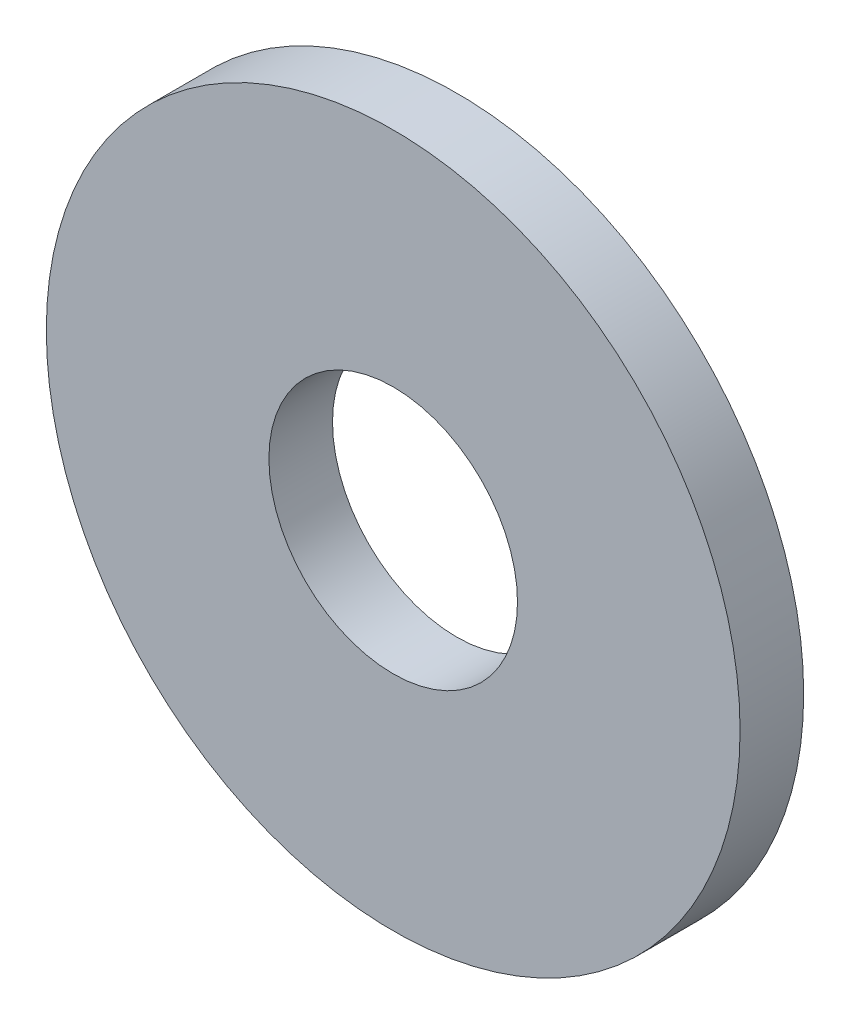
ISO-10303-21;
HEADER;
FILE_DESCRIPTION(('STEP AP214'),'2;1');
FILE_NAME('part.step','',(''),(''),'','','');
FILE_SCHEMA(('AUTOMOTIVE_DESIGN { 1 0 10303 214 1 1 1 1 }'));
ENDSEC;
DATA;
#1=APPLICATION_CONTEXT('core data for automotive mechanical design processes');
#2=APPLICATION_PROTOCOL_DEFINITION('international standard','automotive_design',2000,#1);
#3=PRODUCT_CONTEXT('',#1,'mechanical');
#4=PRODUCT('Part','Part','',(#3));
#5=PRODUCT_RELATED_PRODUCT_CATEGORY('part','',(#4));
#6=PRODUCT_DEFINITION_FORMATION('','',#4);
#7=PRODUCT_DEFINITION_CONTEXT('part definition',#1,'design');
#8=PRODUCT_DEFINITION('design','',#6,#7);
#9=PRODUCT_DEFINITION_SHAPE('','',#8);
#10=(LENGTH_UNIT() NAMED_UNIT(*) SI_UNIT(.MILLI.,.METRE.));
#11=(NAMED_UNIT(*) PLANE_ANGLE_UNIT() SI_UNIT($,.RADIAN.));
#12=(NAMED_UNIT(*) SI_UNIT($,.STERADIAN.) SOLID_ANGLE_UNIT());
#13=UNCERTAINTY_MEASURE_WITH_UNIT(LENGTH_MEASURE(1.E-05),#10,'distance_accuracy_value','');
#14=(GEOMETRIC_REPRESENTATION_CONTEXT(3) GLOBAL_UNCERTAINTY_ASSIGNED_CONTEXT((#13)) GLOBAL_UNIT_ASSIGNED_CONTEXT((#10,
#11,#12)) REPRESENTATION_CONTEXT('',''));
#15=CARTESIAN_POINT('',(0.,0.,0.));
#16=DIRECTION('',(0.,0.,1.));
#17=DIRECTION('',(1.,0.,0.));
#18=AXIS2_PLACEMENT_3D('',#15,#16,#17);
#19=CARTESIAN_POINT('',(0.,0.,0.55));
#20=DIRECTION('',(0.,0.,1.));
#21=DIRECTION('',(1.,0.,0.));
#22=AXIS2_PLACEMENT_3D('',#19,#20,#21);
#23=PLANE('',#22);
#24=CARTESIAN_POINT('',(0.,0.,0.55));
#25=DIRECTION('',(0.,0.,1.));
#26=DIRECTION('',(1.,0.,0.));
#27=AXIS2_PLACEMENT_3D('',#24,#25,#26);
#28=CIRCLE('',#27,6.);
#29=CARTESIAN_POINT('',(6.,0.,0.55));
#30=VERTEX_POINT('',#29);
#31=EDGE_CURVE('E10',#30,#30,#28,.T.);
#32=ORIENTED_EDGE('',*,*,#31,.T.);
#33=EDGE_LOOP('',(#32));
#34=FACE_BOUND('',#33,.T.);
#35=CARTESIAN_POINT('',(0.,0.,0.55));
#36=DIRECTION('',(0.,0.,1.));
#37=DIRECTION('',(1.,0.,0.));
#38=AXIS2_PLACEMENT_3D('',#35,#36,#37);
#39=CIRCLE('',#38,2.15);
#40=CARTESIAN_POINT('',(2.15,0.,0.55));
#41=VERTEX_POINT('',#40);
#42=EDGE_CURVE('E43',#41,#41,#39,.T.);
#43=ORIENTED_EDGE('',*,*,#42,.F.);
#44=EDGE_LOOP('',(#43));
#45=FACE_BOUND('',#44,.T.);
#46=ADVANCED_FACE('F32',(#34,#45),#23,.T.);
#47=CARTESIAN_POINT('',(0.,0.,-0.55));
#48=DIRECTION('',(0.,0.,1.));
#49=DIRECTION('',(1.,0.,0.));
#50=AXIS2_PLACEMENT_3D('',#47,#48,#49);
#51=PLANE('',#50);
#52=CARTESIAN_POINT('',(0.,0.,-0.55));
#53=DIRECTION('',(0.,0.,1.));
#54=DIRECTION('',(1.,0.,0.));
#55=AXIS2_PLACEMENT_3D('',#52,#53,#54);
#56=CIRCLE('',#55,6.);
#57=CARTESIAN_POINT('',(6.,0.,-0.55));
#58=VERTEX_POINT('',#57);
#59=EDGE_CURVE('E36',#58,#58,#56,.T.);
#60=ORIENTED_EDGE('',*,*,#59,.F.);
#61=EDGE_LOOP('',(#60));
#62=FACE_BOUND('',#61,.T.);
#63=CARTESIAN_POINT('',(0.,0.,-0.55));
#64=DIRECTION('',(0.,0.,1.));
#65=DIRECTION('',(1.,0.,0.));
#66=AXIS2_PLACEMENT_3D('',#63,#64,#65);
#67=CIRCLE('',#66,2.15);
#68=CARTESIAN_POINT('',(2.15,0.,-0.55));
#69=VERTEX_POINT('',#68);
#70=EDGE_CURVE('E45',#69,#69,#67,.T.);
#71=ORIENTED_EDGE('',*,*,#70,.T.);
#72=EDGE_LOOP('',(#71));
#73=FACE_BOUND('',#72,.T.);
#74=ADVANCED_FACE('F55',(#62,#73),#51,.F.);
#75=CARTESIAN_POINT('',(0.,0.,0.55));
#76=DIRECTION('',(0.,0.,-1.));
#77=DIRECTION('',(-1.,0.,0.));
#78=AXIS2_PLACEMENT_3D('',#75,#76,#77);
#79=CYLINDRICAL_SURFACE('',#78,6.);
#80=ORIENTED_EDGE('',*,*,#31,.F.);
#81=EDGE_LOOP('',(#80));
#82=FACE_BOUND('',#81,.T.);
#83=ORIENTED_EDGE('',*,*,#59,.T.);
#84=EDGE_LOOP('',(#83));
#85=FACE_BOUND('',#84,.T.);
#86=ADVANCED_FACE('F34',(#82,#85),#79,.T.);
#87=CARTESIAN_POINT('',(0.,0.,0.55));
#88=DIRECTION('',(0.,0.,-1.));
#89=DIRECTION('',(-1.,0.,0.));
#90=AXIS2_PLACEMENT_3D('',#87,#88,#89);
#91=CYLINDRICAL_SURFACE('',#90,2.15);
#92=ORIENTED_EDGE('',*,*,#42,.T.);
#93=EDGE_LOOP('',(#92));
#94=FACE_BOUND('',#93,.T.);
#95=ORIENTED_EDGE('',*,*,#70,.F.);
#96=EDGE_LOOP('',(#95));
#97=FACE_BOUND('',#96,.T.);
#98=ADVANCED_FACE('F51',(#94,#97),#91,.F.);
#99=CLOSED_SHELL('',(#46,#74,#86,#98));
#100=MANIFOLD_SOLID_BREP('B2',#99);
#101=ADVANCED_BREP_SHAPE_REPRESENTATION('',(#18,#100),#14);
#102=SHAPE_DEFINITION_REPRESENTATION(#9,#101);
ENDSEC;
END-ISO-10303-21;
